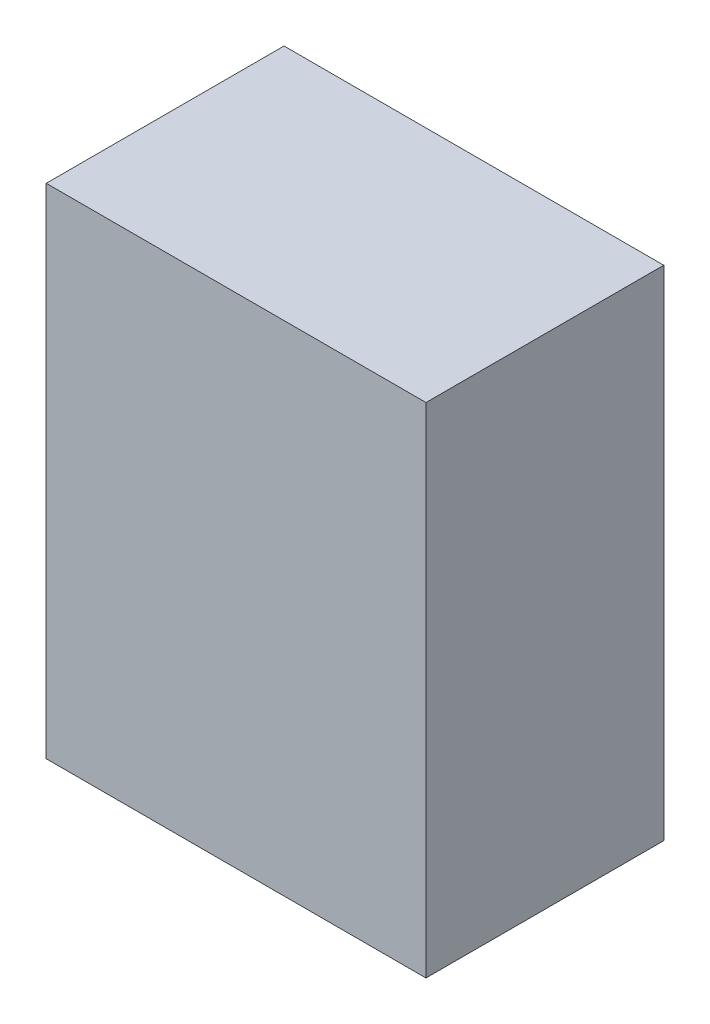
ISO-10303-21;
HEADER;
FILE_DESCRIPTION(('STEP AP214'),'2;1');
FILE_NAME('part.step','',(''),(''),'','','');
FILE_SCHEMA(('AUTOMOTIVE_DESIGN { 1 0 10303 214 1 1 1 1 }'));
ENDSEC;
DATA;
#1=APPLICATION_CONTEXT('core data for automotive mechanical design processes');
#2=APPLICATION_PROTOCOL_DEFINITION('international standard','automotive_design',2000,#1);
#3=PRODUCT_CONTEXT('',#1,'mechanical');
#4=PRODUCT('Part','Part','',(#3));
#5=PRODUCT_RELATED_PRODUCT_CATEGORY('part','',(#4));
#6=PRODUCT_DEFINITION_FORMATION('','',#4);
#7=PRODUCT_DEFINITION_CONTEXT('part definition',#1,'design');
#8=PRODUCT_DEFINITION('design','',#6,#7);
#9=PRODUCT_DEFINITION_SHAPE('','',#8);
#10=(LENGTH_UNIT() NAMED_UNIT(*) SI_UNIT(.MILLI.,.METRE.));
#11=(NAMED_UNIT(*) PLANE_ANGLE_UNIT() SI_UNIT($,.RADIAN.));
#12=(NAMED_UNIT(*) SI_UNIT($,.STERADIAN.) SOLID_ANGLE_UNIT());
#13=UNCERTAINTY_MEASURE_WITH_UNIT(LENGTH_MEASURE(1.E-05),#10,'distance_accuracy_value','');
#14=(GEOMETRIC_REPRESENTATION_CONTEXT(3) GLOBAL_UNCERTAINTY_ASSIGNED_CONTEXT((#13)) GLOBAL_UNIT_ASSIGNED_CONTEXT((#10,
#11,#12)) REPRESENTATION_CONTEXT('',''));
#15=CARTESIAN_POINT('',(0.,0.,0.));
#16=DIRECTION('',(0.,0.,1.));
#17=DIRECTION('',(1.,0.,0.));
#18=AXIS2_PLACEMENT_3D('',#15,#16,#17);
#19=CARTESIAN_POINT('',(0.,0.,0.));
#20=DIRECTION('',(0.,0.,-1.));
#21=DIRECTION('',(-1.,0.,0.));
#22=AXIS2_PLACEMENT_3D('',#19,#20,#21);
#23=PLANE('',#22);
#24=DIRECTION('',(0.,-1.,0.));
#25=VECTOR('',#24,1.);
#26=CARTESIAN_POINT('',(160.,0.,0.));
#27=LINE('',#26,#25);
#28=CARTESIAN_POINT('',(160.,210.,0.));
#29=VERTEX_POINT('',#28);
#30=CARTESIAN_POINT('',(160.,-210.,0.));
#31=VERTEX_POINT('',#30);
#32=EDGE_CURVE('E53',#29,#31,#27,.T.);
#33=ORIENTED_EDGE('',*,*,#32,.T.);
#34=DIRECTION('',(-1.,0.,0.));
#35=VECTOR('',#34,1.);
#36=CARTESIAN_POINT('',(0.,-210.,0.));
#37=LINE('',#36,#35);
#38=CARTESIAN_POINT('',(-160.,-210.,0.));
#39=VERTEX_POINT('',#38);
#40=EDGE_CURVE('E11',#31,#39,#37,.T.);
#41=ORIENTED_EDGE('',*,*,#40,.T.);
#42=DIRECTION('',(0.,1.,0.));
#43=VECTOR('',#42,1.);
#44=CARTESIAN_POINT('',(-160.,0.,0.));
#45=LINE('',#44,#43);
#46=CARTESIAN_POINT('',(-160.,210.,0.));
#47=VERTEX_POINT('',#46);
#48=EDGE_CURVE('E87',#39,#47,#45,.T.);
#49=ORIENTED_EDGE('',*,*,#48,.T.);
#50=DIRECTION('',(1.,0.,0.));
#51=VECTOR('',#50,1.);
#52=CARTESIAN_POINT('',(0.,210.,0.));
#53=LINE('',#52,#51);
#54=EDGE_CURVE('E122',#47,#29,#53,.T.);
#55=ORIENTED_EDGE('',*,*,#54,.T.);
#56=EDGE_LOOP('',(#33,#41,#49,#55));
#57=FACE_BOUND('',#56,.T.);
#58=ADVANCED_FACE('F45',(#57),#23,.T.);
#59=CARTESIAN_POINT('',(0.,1.11022302462516E-13,200.388726282099));
#60=DIRECTION('',(0.,0.,1.));
#61=DIRECTION('',(-1.,0.,0.));
#62=AXIS2_PLACEMENT_3D('',#59,#60,#61);
#63=PLANE('',#62);
#64=DIRECTION('',(-1.,0.,0.));
#65=VECTOR('',#64,1.);
#66=CARTESIAN_POINT('',(160.,-210.,200.388726282099));
#67=LINE('',#66,#65);
#68=CARTESIAN_POINT('',(160.,-210.,200.388726282099));
#69=VERTEX_POINT('',#68);
#70=CARTESIAN_POINT('',(-160.,-210.,200.388726282099));
#71=VERTEX_POINT('',#70);
#72=EDGE_CURVE('E97',#69,#71,#67,.T.);
#73=ORIENTED_EDGE('',*,*,#72,.F.);
#74=DIRECTION('',(0.,-1.,0.));
#75=VECTOR('',#74,1.);
#76=CARTESIAN_POINT('',(160.,210.,200.388726282099));
#77=LINE('',#76,#75);
#78=CARTESIAN_POINT('',(160.,210.,200.388726282099));
#79=VERTEX_POINT('',#78);
#80=EDGE_CURVE('E90',#79,#69,#77,.T.);
#81=ORIENTED_EDGE('',*,*,#80,.F.);
#82=DIRECTION('',(1.,0.,0.));
#83=VECTOR('',#82,1.);
#84=CARTESIAN_POINT('',(160.,210.,200.388726282099));
#85=LINE('',#84,#83);
#86=CARTESIAN_POINT('',(-160.,210.,200.388726282099));
#87=VERTEX_POINT('',#86);
#88=EDGE_CURVE('E100',#87,#79,#85,.T.);
#89=ORIENTED_EDGE('',*,*,#88,.F.);
#90=DIRECTION('',(0.,1.,0.));
#91=VECTOR('',#90,1.);
#92=CARTESIAN_POINT('',(-160.,210.,200.388726282099));
#93=LINE('',#92,#91);
#94=EDGE_CURVE('E85',#71,#87,#93,.T.);
#95=ORIENTED_EDGE('',*,*,#94,.F.);
#96=EDGE_LOOP('',(#73,#81,#89,#95));
#97=FACE_BOUND('',#96,.T.);
#98=ADVANCED_FACE('F95',(#97),#63,.T.);
#99=CARTESIAN_POINT('',(-160.,210.,200.388726282099));
#100=DIRECTION('',(-1.,0.,0.));
#101=DIRECTION('',(0.,1.,0.));
#102=AXIS2_PLACEMENT_3D('',#99,#100,#101);
#103=PLANE('',#102);
#104=DIRECTION('',(0.,0.,-1.));
#105=VECTOR('',#104,1.);
#106=CARTESIAN_POINT('',(-160.,-210.,200.388726282099));
#107=LINE('',#106,#105);
#108=EDGE_CURVE('E82',#71,#39,#107,.T.);
#109=ORIENTED_EDGE('',*,*,#108,.F.);
#110=ORIENTED_EDGE('',*,*,#94,.T.);
#111=DIRECTION('',(0.,0.,-1.));
#112=VECTOR('',#111,1.);
#113=CARTESIAN_POINT('',(-160.,210.,200.388726282099));
#114=LINE('',#113,#112);
#115=EDGE_CURVE('E60',#87,#47,#114,.T.);
#116=ORIENTED_EDGE('',*,*,#115,.T.);
#117=ORIENTED_EDGE('',*,*,#48,.F.);
#118=EDGE_LOOP('',(#109,#110,#116,#117));
#119=FACE_BOUND('',#118,.T.);
#120=ADVANCED_FACE('F84',(#119),#103,.T.);
#121=CARTESIAN_POINT('',(160.,210.,200.388726282099));
#122=DIRECTION('',(0.,1.,0.));
#123=DIRECTION('',(1.,0.,0.));
#124=AXIS2_PLACEMENT_3D('',#121,#122,#123);
#125=PLANE('',#124);
#126=ORIENTED_EDGE('',*,*,#115,.F.);
#127=ORIENTED_EDGE('',*,*,#88,.T.);
#128=DIRECTION('',(0.,0.,-1.));
#129=VECTOR('',#128,1.);
#130=CARTESIAN_POINT('',(160.,210.,200.388726282099));
#131=LINE('',#130,#129);
#132=EDGE_CURVE('E114',#79,#29,#131,.T.);
#133=ORIENTED_EDGE('',*,*,#132,.T.);
#134=ORIENTED_EDGE('',*,*,#54,.F.);
#135=EDGE_LOOP('',(#126,#127,#133,#134));
#136=FACE_BOUND('',#135,.T.);
#137=ADVANCED_FACE('F131',(#136),#125,.T.);
#138=CARTESIAN_POINT('',(160.,210.,200.388726282099));
#139=DIRECTION('',(1.,0.,0.));
#140=DIRECTION('',(0.,-1.,0.));
#141=AXIS2_PLACEMENT_3D('',#138,#139,#140);
#142=PLANE('',#141);
#143=ORIENTED_EDGE('',*,*,#132,.F.);
#144=ORIENTED_EDGE('',*,*,#80,.T.);
#145=DIRECTION('',(0.,0.,-1.));
#146=VECTOR('',#145,1.);
#147=CARTESIAN_POINT('',(160.,-210.,200.388726282099));
#148=LINE('',#147,#146);
#149=EDGE_CURVE('E104',#69,#31,#148,.T.);
#150=ORIENTED_EDGE('',*,*,#149,.T.);
#151=ORIENTED_EDGE('',*,*,#32,.F.);
#152=EDGE_LOOP('',(#143,#144,#150,#151));
#153=FACE_BOUND('',#152,.T.);
#154=ADVANCED_FACE('F129',(#153),#142,.T.);
#155=CARTESIAN_POINT('',(160.,-210.,200.388726282099));
#156=DIRECTION('',(0.,-1.,0.));
#157=DIRECTION('',(-1.,0.,0.));
#158=AXIS2_PLACEMENT_3D('',#155,#156,#157);
#159=PLANE('',#158);
#160=ORIENTED_EDGE('',*,*,#149,.F.);
#161=ORIENTED_EDGE('',*,*,#72,.T.);
#162=ORIENTED_EDGE('',*,*,#108,.T.);
#163=ORIENTED_EDGE('',*,*,#40,.F.);
#164=EDGE_LOOP('',(#160,#161,#162,#163));
#165=FACE_BOUND('',#164,.T.);
#166=ADVANCED_FACE('F103',(#165),#159,.T.);
#167=CLOSED_SHELL('',(#58,#98,#120,#137,#154,#166));
#168=MANIFOLD_SOLID_BREP('B2',#167);
#169=ADVANCED_BREP_SHAPE_REPRESENTATION('',(#18,#168),#14);
#170=SHAPE_DEFINITION_REPRESENTATION(#9,#169);
ENDSEC;
END-ISO-10303-21;
